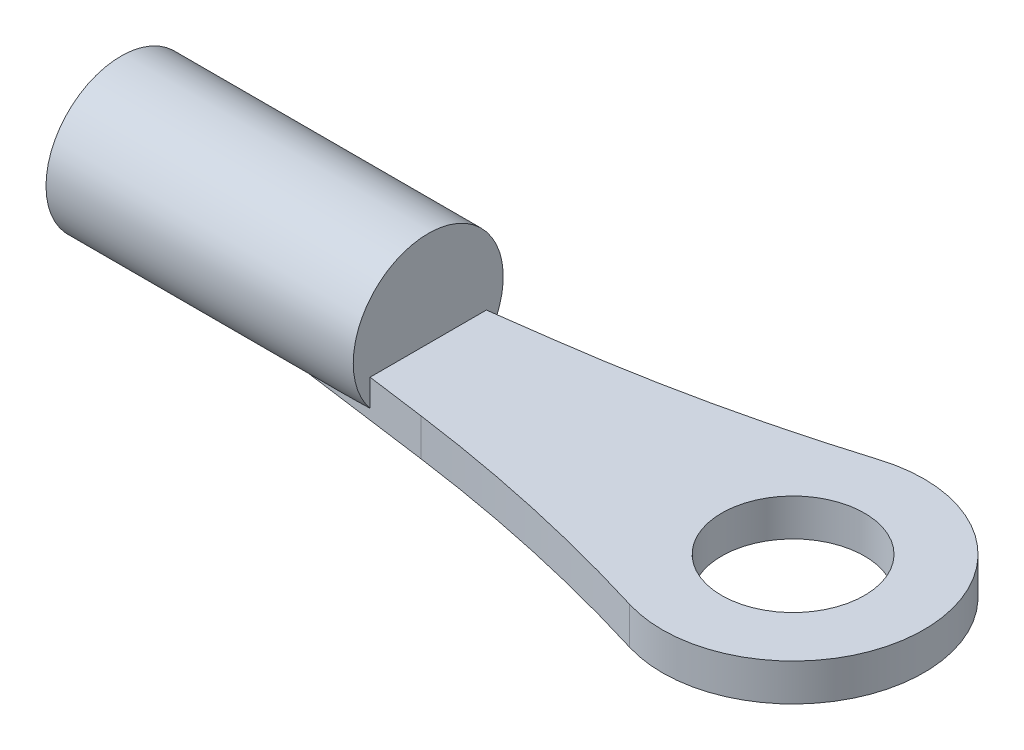
ISO-10303-21;
HEADER;
FILE_DESCRIPTION(('STEP AP214'),'2;1');
FILE_NAME('part.step','',(''),(''),'','','');
FILE_SCHEMA(('AUTOMOTIVE_DESIGN { 1 0 10303 214 1 1 1 1 }'));
ENDSEC;
DATA;
#1=APPLICATION_CONTEXT('core data for automotive mechanical design processes');
#2=APPLICATION_PROTOCOL_DEFINITION('international standard','automotive_design',2000,#1);
#3=PRODUCT_CONTEXT('',#1,'mechanical');
#4=PRODUCT('Part','Part','',(#3));
#5=PRODUCT_RELATED_PRODUCT_CATEGORY('part','',(#4));
#6=PRODUCT_DEFINITION_FORMATION('','',#4);
#7=PRODUCT_DEFINITION_CONTEXT('part definition',#1,'design');
#8=PRODUCT_DEFINITION('design','',#6,#7);
#9=PRODUCT_DEFINITION_SHAPE('','',#8);
#10=(LENGTH_UNIT() NAMED_UNIT(*) SI_UNIT(.MILLI.,.METRE.));
#11=(NAMED_UNIT(*) PLANE_ANGLE_UNIT() SI_UNIT($,.RADIAN.));
#12=(NAMED_UNIT(*) SI_UNIT($,.STERADIAN.) SOLID_ANGLE_UNIT());
#13=UNCERTAINTY_MEASURE_WITH_UNIT(LENGTH_MEASURE(1.E-05),#10,'distance_accuracy_value','');
#14=(GEOMETRIC_REPRESENTATION_CONTEXT(3) GLOBAL_UNCERTAINTY_ASSIGNED_CONTEXT((#13)) GLOBAL_UNIT_ASSIGNED_CONTEXT((#10,
#11,#12)) REPRESENTATION_CONTEXT('',''));
#15=CARTESIAN_POINT('',(0.,0.,0.));
#16=DIRECTION('',(0.,0.,1.));
#17=DIRECTION('',(1.,0.,0.));
#18=AXIS2_PLACEMENT_3D('',#15,#16,#17);
#19=CARTESIAN_POINT('',(-11.2617517144982,0.7874,-36.6367919758403));
#20=DIRECTION('',(0.,-1.,0.));
#21=DIRECTION('',(0.,0.,-1.));
#22=AXIS2_PLACEMENT_3D('',#19,#20,#21);
#23=PLANE('',#22);
#24=CARTESIAN_POINT('',(0.,0.7874,0.));
#25=DIRECTION('',(0.,1.,0.));
#26=DIRECTION('',(0.,0.,1.));
#27=AXIS2_PLACEMENT_3D('',#24,#25,#26);
#28=CIRCLE('',#27,1.5113);
#29=CARTESIAN_POINT('',(0.,0.7874,1.5113));
#30=VERTEX_POINT('',#29);
#31=EDGE_CURVE('E151',#30,#30,#28,.T.);
#32=ORIENTED_EDGE('',*,*,#31,.F.);
#33=EDGE_LOOP('',(#32));
#34=FACE_BOUND('',#33,.T.);
#35=DIRECTION('',(0.,0.,-1.));
#36=VECTOR('',#35,1.);
#37=CARTESIAN_POINT('',(-7.7216,0.7874,-36.6367919758403));
#38=LINE('',#37,#36);
#39=CARTESIAN_POINT('',(-7.7216,0.7874,1.23086249994058));
#40=VERTEX_POINT('',#39);
#41=CARTESIAN_POINT('',(-7.7216,0.7874,-1.23086249994058));
#42=VERTEX_POINT('',#41);
#43=EDGE_CURVE('E115',#40,#42,#38,.T.);
#44=ORIENTED_EDGE('',*,*,#43,.F.);
#45=DIRECTION('',(0.990874330596115,0.,0.134788949716589));
#46=VECTOR('',#45,1.);
#47=CARTESIAN_POINT('',(-6.46865666257625,0.7874,1.40130077984248));
#48=LINE('',#47,#46);
#49=CARTESIAN_POINT('',(-6.46865666257626,0.7874,1.40130077984248));
#50=VERTEX_POINT('',#49);
#51=EDGE_CURVE('E101',#40,#50,#48,.T.);
#52=ORIENTED_EDGE('',*,*,#51,.T.);
#53=CARTESIAN_POINT('',(-11.2617517144981,0.7874,36.6367919758403));
#54=DIRECTION('',(0.,-1.,0.));
#55=DIRECTION('',(0.,0.,1.));
#56=AXIS2_PLACEMENT_3D('',#53,#54,#55);
#57=CIRCLE('',#56,35.56);
#58=CARTESIAN_POINT('',(-0.81347311920497,0.7874,2.64639517916938));
#59=VERTEX_POINT('',#58);
#60=EDGE_CURVE('E110',#50,#59,#57,.T.);
#61=ORIENTED_EDGE('',*,*,#60,.T.);
#62=CARTESIAN_POINT('',(0.,0.7874,0.));
#63=DIRECTION('',(0.,1.,0.));
#64=DIRECTION('',(0.,0.,1.));
#65=AXIS2_PLACEMENT_3D('',#62,#63,#64);
#66=CIRCLE('',#65,2.7686);
#67=CARTESIAN_POINT('',(-0.813473119204972,0.7874,-2.64639517916938));
#68=VERTEX_POINT('',#67);
#69=EDGE_CURVE('E137',#59,#68,#66,.T.);
#70=ORIENTED_EDGE('',*,*,#69,.T.);
#71=CARTESIAN_POINT('',(-11.2617517144982,0.7874,-36.6367919758403));
#72=DIRECTION('',(0.,-1.,0.));
#73=DIRECTION('',(0.,0.,-1.));
#74=AXIS2_PLACEMENT_3D('',#71,#72,#73);
#75=CIRCLE('',#74,35.56);
#76=CARTESIAN_POINT('',(-6.46865666257625,0.7874,-1.40130077984247));
#77=VERTEX_POINT('',#76);
#78=EDGE_CURVE('E140',#68,#77,#75,.T.);
#79=ORIENTED_EDGE('',*,*,#78,.T.);
#80=DIRECTION('',(-0.990874330596115,0.,0.134788949716589));
#81=VECTOR('',#80,1.);
#82=CARTESIAN_POINT('',(-9.30111921315865,0.7874,-1.016));
#83=LINE('',#82,#81);
#84=EDGE_CURVE('E111',#77,#42,#83,.T.);
#85=ORIENTED_EDGE('',*,*,#84,.T.);
#86=EDGE_LOOP('',(#44,#52,#61,#70,#79,#85));
#87=FACE_BOUND('',#86,.T.);
#88=ADVANCED_FACE('F39',(#34,#87),#23,.F.);
#89=CARTESIAN_POINT('',(-11.2617517144982,0.,-36.6367919758403));
#90=DIRECTION('',(0.,-1.,0.));
#91=DIRECTION('',(0.,0.,-1.));
#92=AXIS2_PLACEMENT_3D('',#89,#90,#91);
#93=PLANE('',#92);
#94=DIRECTION('',(-1.,0.,0.));
#95=VECTOR('',#94,1.);
#96=CARTESIAN_POINT('',(-7.7216,0.,1.016));
#97=LINE('',#96,#95);
#98=CARTESIAN_POINT('',(-7.7216,0.,1.016));
#99=VERTEX_POINT('',#98);
#100=CARTESIAN_POINT('',(-9.30111921315866,0.,1.016));
#101=VERTEX_POINT('',#100);
#102=EDGE_CURVE('E59',#99,#101,#97,.T.);
#103=ORIENTED_EDGE('',*,*,#102,.F.);
#104=DIRECTION('',(0.,0.,-1.));
#105=VECTOR('',#104,1.);
#106=CARTESIAN_POINT('',(-7.7216,0.,-36.6367919758403));
#107=LINE('',#106,#105);
#108=CARTESIAN_POINT('',(-7.7216,0.,-1.016));
#109=VERTEX_POINT('',#108);
#110=EDGE_CURVE('E54',#99,#109,#107,.T.);
#111=ORIENTED_EDGE('',*,*,#110,.T.);
#112=DIRECTION('',(-1.,0.,0.));
#113=VECTOR('',#112,1.);
#114=CARTESIAN_POINT('',(-7.7216,0.,-1.016));
#115=LINE('',#114,#113);
#116=CARTESIAN_POINT('',(-9.30111921315865,0.,-1.016));
#117=VERTEX_POINT('',#116);
#118=EDGE_CURVE('E159',#117,#109,#115,.F.);
#119=ORIENTED_EDGE('',*,*,#118,.F.);
#120=DIRECTION('',(-0.990874330596115,0.,0.134788949716589));
#121=VECTOR('',#120,1.);
#122=CARTESIAN_POINT('',(-9.30111921315865,0.,-1.016));
#123=LINE('',#122,#121);
#124=CARTESIAN_POINT('',(-6.46865666257625,0.,-1.40130077984247));
#125=VERTEX_POINT('',#124);
#126=EDGE_CURVE('E145',#125,#117,#123,.T.);
#127=ORIENTED_EDGE('',*,*,#126,.F.);
#128=CARTESIAN_POINT('',(-11.2617517144982,0.,-36.6367919758403));
#129=DIRECTION('',(0.,-1.,0.));
#130=DIRECTION('',(0.,0.,-1.));
#131=AXIS2_PLACEMENT_3D('',#128,#129,#130);
#132=CIRCLE('',#131,35.56);
#133=CARTESIAN_POINT('',(-0.813473119204972,0.,-2.64639517916938));
#134=VERTEX_POINT('',#133);
#135=EDGE_CURVE('E148',#134,#125,#132,.T.);
#136=ORIENTED_EDGE('',*,*,#135,.F.);
#137=CARTESIAN_POINT('',(0.,0.,0.));
#138=DIRECTION('',(0.,1.,0.));
#139=DIRECTION('',(0.,0.,1.));
#140=AXIS2_PLACEMENT_3D('',#137,#138,#139);
#141=CIRCLE('',#140,2.7686);
#142=CARTESIAN_POINT('',(-0.81347311920497,0.,2.64639517916938));
#143=VERTEX_POINT('',#142);
#144=EDGE_CURVE('E138',#143,#134,#141,.T.);
#145=ORIENTED_EDGE('',*,*,#144,.F.);
#146=CARTESIAN_POINT('',(-11.2617517144981,0.,36.6367919758403));
#147=DIRECTION('',(0.,-1.,0.));
#148=DIRECTION('',(0.,0.,1.));
#149=AXIS2_PLACEMENT_3D('',#146,#147,#148);
#150=CIRCLE('',#149,35.56);
#151=CARTESIAN_POINT('',(-6.46865666257626,0.,1.40130077984248));
#152=VERTEX_POINT('',#151);
#153=EDGE_CURVE('E141',#152,#143,#150,.T.);
#154=ORIENTED_EDGE('',*,*,#153,.F.);
#155=DIRECTION('',(0.990874330596115,0.,0.134788949716589));
#156=VECTOR('',#155,1.);
#157=CARTESIAN_POINT('',(-6.46865666257625,0.,1.40130077984248));
#158=LINE('',#157,#156);
#159=EDGE_CURVE('E143',#101,#152,#158,.T.);
#160=ORIENTED_EDGE('',*,*,#159,.F.);
#161=EDGE_LOOP('',(#103,#111,#119,#127,#136,#145,#154,#160));
#162=FACE_BOUND('',#161,.T.);
#163=CARTESIAN_POINT('',(0.,0.,0.));
#164=DIRECTION('',(0.,1.,0.));
#165=DIRECTION('',(0.,0.,1.));
#166=AXIS2_PLACEMENT_3D('',#163,#164,#165);
#167=CIRCLE('',#166,1.5113);
#168=CARTESIAN_POINT('',(0.,0.,1.5113));
#169=VERTEX_POINT('',#168);
#170=EDGE_CURVE('E156',#169,#169,#167,.T.);
#171=ORIENTED_EDGE('',*,*,#170,.T.);
#172=EDGE_LOOP('',(#171));
#173=FACE_BOUND('',#172,.T.);
#174=ADVANCED_FACE('F209',(#162,#173),#93,.T.);
#175=CARTESIAN_POINT('',(-11.2617517144982,0.7874,-36.6367919758403));
#176=DIRECTION('',(0.,-1.,0.));
#177=DIRECTION('',(0.,0.,-1.));
#178=AXIS2_PLACEMENT_3D('',#175,#176,#177);
#179=CYLINDRICAL_SURFACE('',#178,35.56);
#180=ORIENTED_EDGE('',*,*,#135,.T.);
#181=DIRECTION('',(0.,-1.,0.));
#182=VECTOR('',#181,1.);
#183=CARTESIAN_POINT('',(-6.46865666257625,0.7874,-1.40130077984247));
#184=LINE('',#183,#182);
#185=EDGE_CURVE('E126',#77,#125,#184,.T.);
#186=ORIENTED_EDGE('',*,*,#185,.F.);
#187=ORIENTED_EDGE('',*,*,#78,.F.);
#188=DIRECTION('',(0.,-1.,0.));
#189=VECTOR('',#188,1.);
#190=CARTESIAN_POINT('',(-0.813473119204972,0.7874,-2.64639517916938));
#191=LINE('',#190,#189);
#192=EDGE_CURVE('E134',#68,#134,#191,.T.);
#193=ORIENTED_EDGE('',*,*,#192,.T.);
#194=EDGE_LOOP('',(#180,#186,#187,#193));
#195=FACE_BOUND('',#194,.T.);
#196=ADVANCED_FACE('F41',(#195),#179,.F.);
#197=CARTESIAN_POINT('',(-9.30111921315865,0.7874,-1.016));
#198=DIRECTION('',(0.134788949716589,0.,0.990874330596115));
#199=DIRECTION('',(0.990874330596115,0.,-0.134788949716589));
#200=AXIS2_PLACEMENT_3D('',#197,#198,#199);
#201=PLANE('',#200);
#202=ORIENTED_EDGE('',*,*,#126,.T.);
#203=CARTESIAN_POINT('',(-16.7700424594813,1.21979516723096,0.));
#204=DIRECTION('',(0.134788949716589,0.,0.990874330596115));
#205=DIRECTION('',(-0.990874330596115,0.,0.134788949716589));
#206=AXIS2_PLACEMENT_3D('',#203,#204,#205);
#207=ELLIPSE('',#206,11.7776717107591,1.5875);
#208=CARTESIAN_POINT('',(-7.7216,0.217231575113218,-1.23086249994058));
#209=VERTEX_POINT('',#208);
#210=EDGE_CURVE('E163',#117,#209,#207,.T.);
#211=ORIENTED_EDGE('',*,*,#210,.T.);
#212=DIRECTION('',(0.,-1.,0.));
#213=VECTOR('',#212,1.);
#214=CARTESIAN_POINT('',(-7.7216,0.7874,-1.23086249994058));
#215=LINE('',#214,#213);
#216=EDGE_CURVE('E119',#42,#209,#215,.T.);
#217=ORIENTED_EDGE('',*,*,#216,.F.);
#218=ORIENTED_EDGE('',*,*,#84,.F.);
#219=ORIENTED_EDGE('',*,*,#185,.T.);
#220=EDGE_LOOP('',(#202,#211,#217,#218,#219));
#221=FACE_BOUND('',#220,.T.);
#222=ADVANCED_FACE('F226',(#221),#201,.F.);
#223=CARTESIAN_POINT('',(-6.46865666257625,0.7874,1.40130077984248));
#224=DIRECTION('',(0.134788949716589,0.,-0.990874330596115));
#225=DIRECTION('',(-0.990874330596115,0.,-0.134788949716589));
#226=AXIS2_PLACEMENT_3D('',#223,#224,#225);
#227=PLANE('',#226);
#228=DIRECTION('',(0.,1.,0.));
#229=VECTOR('',#228,1.);
#230=CARTESIAN_POINT('',(-7.7216,0.7874,1.23086249994058));
#231=LINE('',#230,#229);
#232=CARTESIAN_POINT('',(-7.7216,0.217231575113217,1.23086249994058));
#233=VERTEX_POINT('',#232);
#234=EDGE_CURVE('E47',#233,#40,#231,.T.);
#235=ORIENTED_EDGE('',*,*,#234,.F.);
#236=CARTESIAN_POINT('',(-16.7700424594814,1.21979516723096,0.));
#237=DIRECTION('',(0.134788949716589,0.,-0.990874330596115));
#238=DIRECTION('',(-0.990874330596115,0.,-0.134788949716589));
#239=AXIS2_PLACEMENT_3D('',#236,#237,#238);
#240=ELLIPSE('',#239,11.7776717107591,1.5875);
#241=EDGE_CURVE('E11',#233,#101,#240,.T.);
#242=ORIENTED_EDGE('',*,*,#241,.T.);
#243=ORIENTED_EDGE('',*,*,#159,.T.);
#244=DIRECTION('',(0.,-1.,0.));
#245=VECTOR('',#244,1.);
#246=CARTESIAN_POINT('',(-6.46865666257626,0.7874,1.40130077984248));
#247=LINE('',#246,#245);
#248=EDGE_CURVE('E107',#50,#152,#247,.T.);
#249=ORIENTED_EDGE('',*,*,#248,.F.);
#250=ORIENTED_EDGE('',*,*,#51,.F.);
#251=EDGE_LOOP('',(#235,#242,#243,#249,#250));
#252=FACE_BOUND('',#251,.T.);
#253=ADVANCED_FACE('F103',(#252),#227,.F.);
#254=CARTESIAN_POINT('',(-11.2617517144981,0.7874,36.6367919758403));
#255=DIRECTION('',(0.,-1.,0.));
#256=DIRECTION('',(0.,0.,-1.));
#257=AXIS2_PLACEMENT_3D('',#254,#255,#256);
#258=CYLINDRICAL_SURFACE('',#257,35.56);
#259=ORIENTED_EDGE('',*,*,#153,.T.);
#260=DIRECTION('',(0.,-1.,0.));
#261=VECTOR('',#260,1.);
#262=CARTESIAN_POINT('',(-0.81347311920497,0.7874,2.64639517916938));
#263=LINE('',#262,#261);
#264=EDGE_CURVE('E131',#59,#143,#263,.T.);
#265=ORIENTED_EDGE('',*,*,#264,.F.);
#266=ORIENTED_EDGE('',*,*,#60,.F.);
#267=ORIENTED_EDGE('',*,*,#248,.T.);
#268=EDGE_LOOP('',(#259,#265,#266,#267));
#269=FACE_BOUND('',#268,.T.);
#270=ADVANCED_FACE('F220',(#269),#258,.F.);
#271=CARTESIAN_POINT('',(0.,0.7874,0.));
#272=DIRECTION('',(0.,-1.,0.));
#273=DIRECTION('',(0.,0.,-1.));
#274=AXIS2_PLACEMENT_3D('',#271,#272,#273);
#275=CYLINDRICAL_SURFACE('',#274,2.7686);
#276=ORIENTED_EDGE('',*,*,#144,.T.);
#277=ORIENTED_EDGE('',*,*,#192,.F.);
#278=ORIENTED_EDGE('',*,*,#69,.F.);
#279=ORIENTED_EDGE('',*,*,#264,.T.);
#280=EDGE_LOOP('',(#276,#277,#278,#279));
#281=FACE_BOUND('',#280,.T.);
#282=ADVANCED_FACE('F204',(#281),#275,.T.);
#283=CARTESIAN_POINT('',(0.,0.7874,0.));
#284=DIRECTION('',(0.,-1.,0.));
#285=DIRECTION('',(0.,0.,-1.));
#286=AXIS2_PLACEMENT_3D('',#283,#284,#285);
#287=CYLINDRICAL_SURFACE('',#286,1.5113);
#288=ORIENTED_EDGE('',*,*,#31,.T.);
#289=EDGE_LOOP('',(#288));
#290=FACE_BOUND('',#289,.T.);
#291=ORIENTED_EDGE('',*,*,#170,.F.);
#292=EDGE_LOOP('',(#291));
#293=FACE_BOUND('',#292,.T.);
#294=ADVANCED_FACE('F196',(#290,#293),#287,.F.);
#295=CARTESIAN_POINT('',(-7.7216,1.21979516723096,0.));
#296=DIRECTION('',(-1.,0.,0.));
#297=DIRECTION('',(0.,0.,1.));
#298=AXIS2_PLACEMENT_3D('',#295,#296,#297);
#299=CYLINDRICAL_SURFACE('',#298,1.5875);
#300=ORIENTED_EDGE('',*,*,#210,.F.);
#301=ORIENTED_EDGE('',*,*,#118,.T.);
#302=CARTESIAN_POINT('',(-7.7216,1.21979516723096,0.));
#303=DIRECTION('',(-1.,0.,0.));
#304=DIRECTION('',(0.,0.,1.));
#305=AXIS2_PLACEMENT_3D('',#302,#303,#304);
#306=CIRCLE('',#305,1.5875);
#307=EDGE_CURVE('E120',#109,#99,#306,.T.);
#308=ORIENTED_EDGE('',*,*,#307,.T.);
#309=ORIENTED_EDGE('',*,*,#102,.T.);
#310=ORIENTED_EDGE('',*,*,#241,.F.);
#311=EDGE_CURVE('E125',#233,#209,#306,.T.);
#312=ORIENTED_EDGE('',*,*,#311,.T.);
#313=EDGE_LOOP('',(#300,#301,#308,#309,#310,#312));
#314=FACE_BOUND('',#313,.T.);
#315=CARTESIAN_POINT('',(-14.224,1.21979516723096,0.));
#316=DIRECTION('',(-1.,0.,0.));
#317=DIRECTION('',(0.,0.,1.));
#318=AXIS2_PLACEMENT_3D('',#315,#316,#317);
#319=CIRCLE('',#318,1.5875);
#320=CARTESIAN_POINT('',(-14.224,1.21979516723096,1.5875));
#321=VERTEX_POINT('',#320);
#322=EDGE_CURVE('E168',#321,#321,#319,.T.);
#323=ORIENTED_EDGE('',*,*,#322,.F.);
#324=EDGE_LOOP('',(#323));
#325=FACE_BOUND('',#324,.T.);
#326=ADVANCED_FACE('F194',(#314,#325),#299,.T.);
#327=CARTESIAN_POINT('',(-7.7216,1.21979516723096,0.));
#328=DIRECTION('',(-1.,0.,0.));
#329=DIRECTION('',(0.,0.,1.));
#330=AXIS2_PLACEMENT_3D('',#327,#328,#329);
#331=PLANE('',#330);
#332=ORIENTED_EDGE('',*,*,#43,.T.);
#333=ORIENTED_EDGE('',*,*,#216,.T.);
#334=ORIENTED_EDGE('',*,*,#311,.F.);
#335=ORIENTED_EDGE('',*,*,#234,.T.);
#336=EDGE_LOOP('',(#332,#333,#334,#335));
#337=FACE_BOUND('',#336,.T.);
#338=ADVANCED_FACE('F123',(#337),#331,.F.);
#339=ORIENTED_EDGE('',*,*,#110,.F.);
#340=ORIENTED_EDGE('',*,*,#307,.F.);
#341=EDGE_LOOP('',(#339,#340));
#342=FACE_BOUND('',#341,.T.);
#343=ADVANCED_FACE('F190',(#342),#331,.F.);
#344=CARTESIAN_POINT('',(-14.224,0.7874,0.));
#345=DIRECTION('',(1.,0.,0.));
#346=DIRECTION('',(0.,0.,-1.));
#347=AXIS2_PLACEMENT_3D('',#344,#345,#346);
#348=PLANE('',#347);
#349=CARTESIAN_POINT('',(-14.224,1.21979516723096,0.));
#350=DIRECTION('',(-1.,0.,0.));
#351=DIRECTION('',(0.,0.,1.));
#352=AXIS2_PLACEMENT_3D('',#349,#350,#351);
#353=CIRCLE('',#352,1.11850284954718);
#354=CARTESIAN_POINT('',(-14.224,1.21979516723096,1.11850284954718));
#355=VERTEX_POINT('',#354);
#356=EDGE_CURVE('E173',#355,#355,#353,.T.);
#357=ORIENTED_EDGE('',*,*,#356,.F.);
#358=EDGE_LOOP('',(#357));
#359=FACE_BOUND('',#358,.T.);
#360=ORIENTED_EDGE('',*,*,#322,.T.);
#361=EDGE_LOOP('',(#360));
#362=FACE_BOUND('',#361,.T.);
#363=ADVANCED_FACE('F184',(#359,#362),#348,.F.);
#364=CARTESIAN_POINT('',(-11.684,1.21979516723096,0.));
#365=DIRECTION('',(-1.,0.,0.));
#366=DIRECTION('',(0.,0.,1.));
#367=AXIS2_PLACEMENT_3D('',#364,#365,#366);
#368=CYLINDRICAL_SURFACE('',#367,1.11850284954718);
#369=CARTESIAN_POINT('',(-11.684,1.21979516723096,0.));
#370=DIRECTION('',(-1.,0.,0.));
#371=DIRECTION('',(0.,0.,1.));
#372=AXIS2_PLACEMENT_3D('',#369,#370,#371);
#373=CIRCLE('',#372,1.11850284954718);
#374=CARTESIAN_POINT('',(-11.684,1.21979516723096,1.11850284954718));
#375=VERTEX_POINT('',#374);
#376=EDGE_CURVE('E171',#375,#375,#373,.T.);
#377=ORIENTED_EDGE('',*,*,#376,.F.);
#378=EDGE_LOOP('',(#377));
#379=FACE_BOUND('',#378,.T.);
#380=ORIENTED_EDGE('',*,*,#356,.T.);
#381=EDGE_LOOP('',(#380));
#382=FACE_BOUND('',#381,.T.);
#383=ADVANCED_FACE('F181',(#379,#382),#368,.F.);
#384=CARTESIAN_POINT('',(-11.684,1.21979516723096,0.));
#385=DIRECTION('',(-1.,0.,0.));
#386=DIRECTION('',(0.,0.,1.));
#387=AXIS2_PLACEMENT_3D('',#384,#385,#386);
#388=PLANE('',#387);
#389=ORIENTED_EDGE('',*,*,#376,.T.);
#390=EDGE_LOOP('',(#389));
#391=FACE_BOUND('',#390,.T.);
#392=ADVANCED_FACE('F179',(#391),#388,.T.);
#393=CLOSED_SHELL('',(#88,#174,#196,#222,#253,#270,#282,#294,#326,#338,#343,#363,#383,#392));
#394=MANIFOLD_SOLID_BREP('B2',#393);
#395=ADVANCED_BREP_SHAPE_REPRESENTATION('',(#18,#394),#14);
#396=SHAPE_DEFINITION_REPRESENTATION(#9,#395);
ENDSEC;
END-ISO-10303-21;
